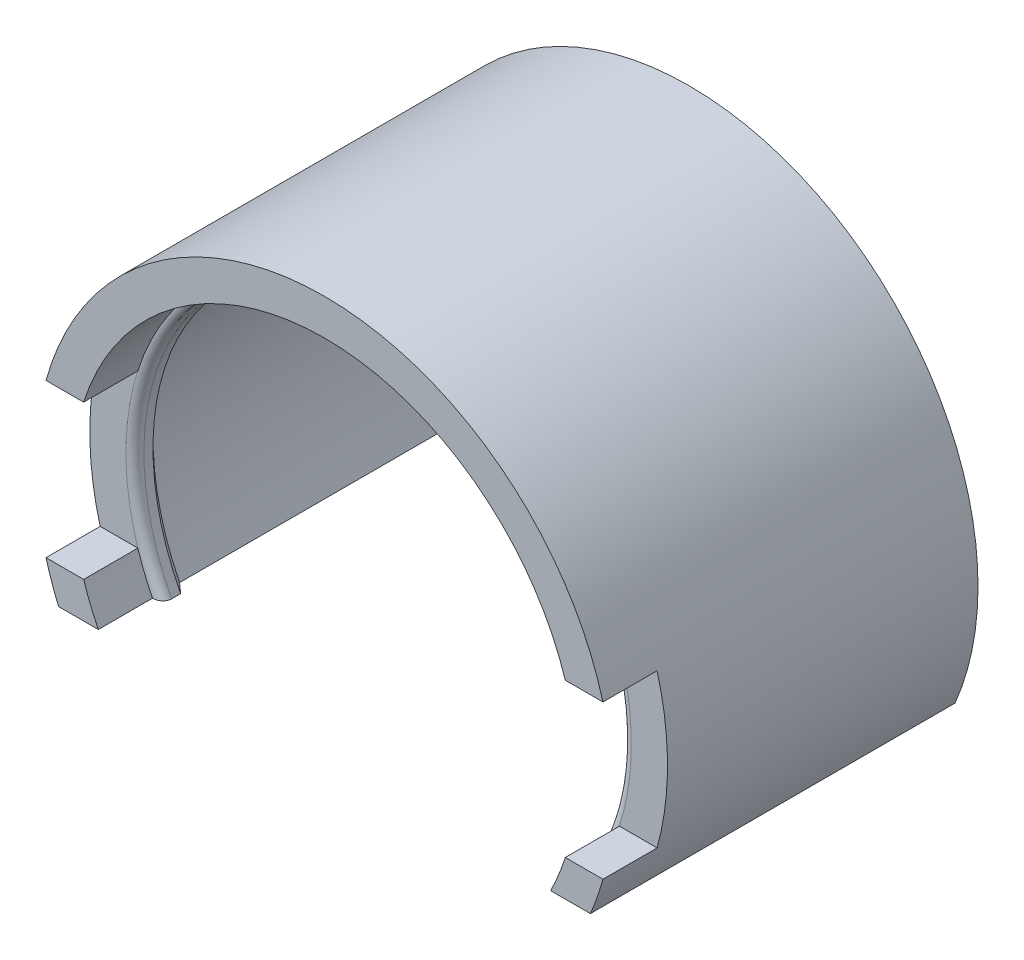
ISO-10303-21;
HEADER;
FILE_DESCRIPTION(('STEP AP214'),'2;1');
FILE_NAME('part.step','',(''),(''),'','','');
FILE_SCHEMA(('AUTOMOTIVE_DESIGN { 1 0 10303 214 1 1 1 1 }'));
ENDSEC;
DATA;
#1=APPLICATION_CONTEXT('core data for automotive mechanical design processes');
#2=APPLICATION_PROTOCOL_DEFINITION('international standard','automotive_design',2000,#1);
#3=PRODUCT_CONTEXT('',#1,'mechanical');
#4=PRODUCT('Part','Part','',(#3));
#5=PRODUCT_RELATED_PRODUCT_CATEGORY('part','',(#4));
#6=PRODUCT_DEFINITION_FORMATION('','',#4);
#7=PRODUCT_DEFINITION_CONTEXT('part definition',#1,'design');
#8=PRODUCT_DEFINITION('design','',#6,#7);
#9=PRODUCT_DEFINITION_SHAPE('','',#8);
#10=(LENGTH_UNIT() NAMED_UNIT(*) SI_UNIT(.MILLI.,.METRE.));
#11=(NAMED_UNIT(*) PLANE_ANGLE_UNIT() SI_UNIT($,.RADIAN.));
#12=(NAMED_UNIT(*) SI_UNIT($,.STERADIAN.) SOLID_ANGLE_UNIT());
#13=UNCERTAINTY_MEASURE_WITH_UNIT(LENGTH_MEASURE(1.E-05),#10,'distance_accuracy_value','');
#14=(GEOMETRIC_REPRESENTATION_CONTEXT(3) GLOBAL_UNCERTAINTY_ASSIGNED_CONTEXT((#13)) GLOBAL_UNIT_ASSIGNED_CONTEXT((#10,
#11,#12)) REPRESENTATION_CONTEXT('',''));
#15=CARTESIAN_POINT('',(0.,0.,0.));
#16=DIRECTION('',(0.,0.,1.));
#17=DIRECTION('',(1.,0.,0.));
#18=AXIS2_PLACEMENT_3D('',#15,#16,#17);
#19=CARTESIAN_POINT('',(0.,0.,16.2));
#20=DIRECTION('',(0.,0.,-1.));
#21=DIRECTION('',(-1.,0.,0.));
#22=AXIS2_PLACEMENT_3D('',#19,#20,#21);
#23=PLANE('',#22);
#24=DIRECTION('',(1.,0.,0.));
#25=VECTOR('',#24,1.);
#26=CARTESIAN_POINT('',(-17.5,-4.25,16.2));
#27=LINE('',#26,#25);
#28=CARTESIAN_POINT('',(-15.4252228509023,-4.25,16.2));
#29=VERTEX_POINT('',#28);
#30=CARTESIAN_POINT('',(-13.3393215719541,-4.25,16.2));
#31=VERTEX_POINT('',#30);
#32=EDGE_CURVE('E383',#29,#31,#27,.T.);
#33=ORIENTED_EDGE('',*,*,#32,.T.);
#34=CARTESIAN_POINT('',(0.,0.,16.2));
#35=DIRECTION('',(0.,0.,-1.));
#36=DIRECTION('',(-1.,0.,0.));
#37=AXIS2_PLACEMENT_3D('',#34,#35,#36);
#38=CIRCLE('',#37,14.);
#39=CARTESIAN_POINT('',(-13.3393215719541,4.25,16.2));
#40=VERTEX_POINT('',#39);
#41=EDGE_CURVE('E189',#31,#40,#38,.T.);
#42=ORIENTED_EDGE('',*,*,#41,.T.);
#43=DIRECTION('',(-1.,0.,0.));
#44=VECTOR('',#43,1.);
#45=CARTESIAN_POINT('',(-17.5,4.25,16.2));
#46=LINE('',#45,#44);
#47=CARTESIAN_POINT('',(-15.4252228509023,4.25,16.2));
#48=VERTEX_POINT('',#47);
#49=EDGE_CURVE('E273',#40,#48,#46,.T.);
#50=ORIENTED_EDGE('',*,*,#49,.T.);
#51=CARTESIAN_POINT('',(0.,0.,16.2));
#52=DIRECTION('',(0.,0.,-1.));
#53=DIRECTION('',(-1.,0.,0.));
#54=AXIS2_PLACEMENT_3D('',#51,#52,#53);
#55=CIRCLE('',#54,16.);
#56=EDGE_CURVE('E352',#29,#48,#55,.T.);
#57=ORIENTED_EDGE('',*,*,#56,.F.);
#58=EDGE_LOOP('',(#33,#42,#50,#57));
#59=FACE_BOUND('',#58,.T.);
#60=ADVANCED_FACE('F49',(#59),#23,.F.);
#61=CARTESIAN_POINT('',(0.,0.,19.2));
#62=DIRECTION('',(0.,0.,-1.));
#63=DIRECTION('',(-1.,0.,0.));
#64=AXIS2_PLACEMENT_3D('',#61,#62,#63);
#65=CYLINDRICAL_SURFACE('',#64,14.);
#66=DIRECTION('',(0.,0.,-1.));
#67=VECTOR('',#66,1.);
#68=CARTESIAN_POINT('',(12.5274698163675,-6.25,19.2));
#69=LINE('',#68,#67);
#70=CARTESIAN_POINT('',(12.5274698163675,-6.25,14.7));
#71=VERTEX_POINT('',#70);
#72=CARTESIAN_POINT('',(12.5274698163675,-6.25,0.));
#73=VERTEX_POINT('',#72);
#74=EDGE_CURVE('E307',#71,#73,#69,.T.);
#75=ORIENTED_EDGE('',*,*,#74,.F.);
#76=CARTESIAN_POINT('',(0.,0.,14.7));
#77=DIRECTION('',(0.,0.,1.));
#78=DIRECTION('',(1.,0.,0.));
#79=AXIS2_PLACEMENT_3D('',#76,#77,#78);
#80=CIRCLE('',#79,14.);
#81=CARTESIAN_POINT('',(-12.5274698163675,-6.25,14.7));
#82=VERTEX_POINT('',#81);
#83=EDGE_CURVE('E185',#71,#82,#80,.T.);
#84=ORIENTED_EDGE('',*,*,#83,.T.);
#85=DIRECTION('',(0.,0.,-1.));
#86=VECTOR('',#85,1.);
#87=CARTESIAN_POINT('',(-12.5274698163675,-6.25,19.2));
#88=LINE('',#87,#86);
#89=CARTESIAN_POINT('',(-12.5274698163675,-6.25,0.));
#90=VERTEX_POINT('',#89);
#91=EDGE_CURVE('E302',#82,#90,#88,.T.);
#92=ORIENTED_EDGE('',*,*,#91,.T.);
#93=CARTESIAN_POINT('',(0.,0.,0.));
#94=DIRECTION('',(0.,0.,1.));
#95=DIRECTION('',(1.,0.,0.));
#96=AXIS2_PLACEMENT_3D('',#93,#94,#95);
#97=CIRCLE('',#96,14.);
#98=EDGE_CURVE('E335',#73,#90,#97,.T.);
#99=ORIENTED_EDGE('',*,*,#98,.F.);
#100=EDGE_LOOP('',(#75,#84,#92,#99));
#101=FACE_BOUND('',#100,.T.);
#102=ADVANCED_FACE('F238',(#101),#65,.F.);
#103=CARTESIAN_POINT('',(0.,0.,16.2));
#104=DIRECTION('',(0.,0.,1.));
#105=DIRECTION('',(1.,0.,0.));
#106=AXIS2_PLACEMENT_3D('',#103,#104,#105);
#107=CIRCLE('',#106,14.);
#108=CARTESIAN_POINT('',(13.3393215719541,4.25,16.2));
#109=VERTEX_POINT('',#108);
#110=EDGE_CURVE('E277',#109,#40,#107,.T.);
#111=ORIENTED_EDGE('',*,*,#110,.F.);
#112=DIRECTION('',(0.,0.,-1.));
#113=VECTOR('',#112,1.);
#114=CARTESIAN_POINT('',(13.3393215719541,4.25,19.2));
#115=LINE('',#114,#113);
#116=CARTESIAN_POINT('',(13.3393215719541,4.25,19.2));
#117=VERTEX_POINT('',#116);
#118=EDGE_CURVE('E377',#117,#109,#115,.T.);
#119=ORIENTED_EDGE('',*,*,#118,.F.);
#120=CARTESIAN_POINT('',(0.,0.,19.2));
#121=DIRECTION('',(0.,0.,1.));
#122=DIRECTION('',(1.,0.,0.));
#123=AXIS2_PLACEMENT_3D('',#120,#121,#122);
#124=CIRCLE('',#123,14.);
#125=CARTESIAN_POINT('',(-13.3393215719541,4.25,19.2));
#126=VERTEX_POINT('',#125);
#127=EDGE_CURVE('E313',#117,#126,#124,.T.);
#128=ORIENTED_EDGE('',*,*,#127,.T.);
#129=DIRECTION('',(0.,0.,-1.));
#130=VECTOR('',#129,1.);
#131=CARTESIAN_POINT('',(-13.3393215719541,4.25,19.2));
#132=LINE('',#131,#130);
#133=EDGE_CURVE('E380',#40,#126,#132,.F.);
#134=ORIENTED_EDGE('',*,*,#133,.F.);
#135=EDGE_LOOP('',(#111,#119,#128,#134));
#136=FACE_BOUND('',#135,.T.);
#137=ADVANCED_FACE('F246',(#136),#65,.F.);
#138=CARTESIAN_POINT('',(-12.5274698163675,-6.25,16.2));
#139=VERTEX_POINT('',#138);
#140=EDGE_CURVE('E394',#31,#139,#107,.T.);
#141=ORIENTED_EDGE('',*,*,#140,.F.);
#142=DIRECTION('',(0.,0.,-1.));
#143=VECTOR('',#142,1.);
#144=CARTESIAN_POINT('',(-13.3393215719541,-4.25,19.2));
#145=LINE('',#144,#143);
#146=CARTESIAN_POINT('',(-13.3393215719541,-4.25,19.2));
#147=VERTEX_POINT('',#146);
#148=EDGE_CURVE('E363',#147,#31,#145,.T.);
#149=ORIENTED_EDGE('',*,*,#148,.F.);
#150=CARTESIAN_POINT('',(-12.5274698163675,-6.25,19.2));
#151=VERTEX_POINT('',#150);
#152=EDGE_CURVE('E315',#147,#151,#124,.T.);
#153=ORIENTED_EDGE('',*,*,#152,.T.);
#154=EDGE_CURVE('E298',#151,#139,#88,.T.);
#155=ORIENTED_EDGE('',*,*,#154,.T.);
#156=EDGE_LOOP('',(#141,#149,#153,#155));
#157=FACE_BOUND('',#156,.T.);
#158=ADVANCED_FACE('F399',(#157),#65,.F.);
#159=CARTESIAN_POINT('',(0.,0.,19.2));
#160=DIRECTION('',(0.,0.,1.));
#161=DIRECTION('',(1.,0.,0.));
#162=AXIS2_PLACEMENT_3D('',#159,#160,#161);
#163=PLANE('',#162);
#164=DIRECTION('',(1.,0.,0.));
#165=VECTOR('',#164,1.);
#166=CARTESIAN_POINT('',(0.,-4.25,19.2));
#167=LINE('',#166,#165);
#168=CARTESIAN_POINT('',(13.3393215719541,-4.25,19.2));
#169=VERTEX_POINT('',#168);
#170=CARTESIAN_POINT('',(15.4252228509023,-4.25,19.2));
#171=VERTEX_POINT('',#170);
#172=EDGE_CURVE('E285',#169,#171,#167,.T.);
#173=ORIENTED_EDGE('',*,*,#172,.F.);
#174=CARTESIAN_POINT('',(12.5274698163675,-6.25,19.2));
#175=VERTEX_POINT('',#174);
#176=EDGE_CURVE('E310',#175,#169,#124,.T.);
#177=ORIENTED_EDGE('',*,*,#176,.F.);
#178=DIRECTION('',(1.,0.,0.));
#179=VECTOR('',#178,1.);
#180=CARTESIAN_POINT('',(0.,-6.25,19.2));
#181=LINE('',#180,#179);
#182=CARTESIAN_POINT('',(14.7287983216554,-6.25,19.2));
#183=VERTEX_POINT('',#182);
#184=EDGE_CURVE('E324',#175,#183,#181,.T.);
#185=ORIENTED_EDGE('',*,*,#184,.T.);
#186=CARTESIAN_POINT('',(0.,0.,19.2));
#187=DIRECTION('',(0.,0.,1.));
#188=DIRECTION('',(1.,0.,0.));
#189=AXIS2_PLACEMENT_3D('',#186,#187,#188);
#190=CIRCLE('',#189,16.);
#191=EDGE_CURVE('E322',#183,#171,#190,.T.);
#192=ORIENTED_EDGE('',*,*,#191,.T.);
#193=EDGE_LOOP('',(#173,#177,#185,#192));
#194=FACE_BOUND('',#193,.T.);
#195=ADVANCED_FACE('F426',(#194),#163,.T.);
#196=CARTESIAN_POINT('',(-15.4252228509023,-4.25,19.2));
#197=VERTEX_POINT('',#196);
#198=EDGE_CURVE('E283',#197,#147,#167,.T.);
#199=ORIENTED_EDGE('',*,*,#198,.F.);
#200=CARTESIAN_POINT('',(-14.7287983216554,-6.25,19.2));
#201=VERTEX_POINT('',#200);
#202=EDGE_CURVE('E329',#197,#201,#190,.T.);
#203=ORIENTED_EDGE('',*,*,#202,.T.);
#204=EDGE_CURVE('E319',#201,#151,#181,.T.);
#205=ORIENTED_EDGE('',*,*,#204,.T.);
#206=ORIENTED_EDGE('',*,*,#152,.F.);
#207=EDGE_LOOP('',(#199,#203,#205,#206));
#208=FACE_BOUND('',#207,.T.);
#209=ADVANCED_FACE('F410',(#208),#163,.T.);
#210=CARTESIAN_POINT('',(0.,0.,19.2));
#211=DIRECTION('',(0.,0.,-1.));
#212=DIRECTION('',(-1.,0.,0.));
#213=AXIS2_PLACEMENT_3D('',#210,#211,#212);
#214=CYLINDRICAL_SURFACE('',#213,16.);
#215=CARTESIAN_POINT('',(15.4252228509023,4.25,16.2));
#216=VERTEX_POINT('',#215);
#217=CARTESIAN_POINT('',(15.4252228509023,-4.25,16.2));
#218=VERTEX_POINT('',#217);
#219=EDGE_CURVE('E267',#216,#218,#55,.T.);
#220=ORIENTED_EDGE('',*,*,#219,.T.);
#221=DIRECTION('',(0.,0.,-1.));
#222=VECTOR('',#221,1.);
#223=CARTESIAN_POINT('',(15.4252228509023,-4.25,19.2));
#224=LINE('',#223,#222);
#225=EDGE_CURVE('E359',#218,#171,#224,.F.);
#226=ORIENTED_EDGE('',*,*,#225,.T.);
#227=ORIENTED_EDGE('',*,*,#191,.F.);
#228=DIRECTION('',(0.,0.,-1.));
#229=VECTOR('',#228,1.);
#230=CARTESIAN_POINT('',(14.7287983216554,-6.25,19.2));
#231=LINE('',#230,#229);
#232=CARTESIAN_POINT('',(14.7287983216554,-6.25,-1.));
#233=VERTEX_POINT('',#232);
#234=EDGE_CURVE('E293',#183,#233,#231,.T.);
#235=ORIENTED_EDGE('',*,*,#234,.T.);
#236=CARTESIAN_POINT('',(0.,0.,-1.));
#237=DIRECTION('',(0.,0.,1.));
#238=DIRECTION('',(1.,0.,0.));
#239=AXIS2_PLACEMENT_3D('',#236,#237,#238);
#240=CIRCLE('',#239,16.);
#241=CARTESIAN_POINT('',(-14.7287983216554,-6.25,-1.));
#242=VERTEX_POINT('',#241);
#243=EDGE_CURVE('E338',#233,#242,#240,.T.);
#244=ORIENTED_EDGE('',*,*,#243,.T.);
#245=DIRECTION('',(0.,0.,-1.));
#246=VECTOR('',#245,1.);
#247=CARTESIAN_POINT('',(-14.7287983216554,-6.25,19.2));
#248=LINE('',#247,#246);
#249=EDGE_CURVE('E295',#201,#242,#248,.T.);
#250=ORIENTED_EDGE('',*,*,#249,.F.);
#251=ORIENTED_EDGE('',*,*,#202,.F.);
#252=DIRECTION('',(0.,0.,-1.));
#253=VECTOR('',#252,1.);
#254=CARTESIAN_POINT('',(-15.4252228509023,-4.25,19.2));
#255=LINE('',#254,#253);
#256=EDGE_CURVE('E356',#197,#29,#255,.T.);
#257=ORIENTED_EDGE('',*,*,#256,.T.);
#258=ORIENTED_EDGE('',*,*,#56,.T.);
#259=DIRECTION('',(0.,0.,-1.));
#260=VECTOR('',#259,1.);
#261=CARTESIAN_POINT('',(-15.4252228509023,4.25,19.2));
#262=LINE('',#261,#260);
#263=CARTESIAN_POINT('',(-15.4252228509023,4.25,19.2));
#264=VERTEX_POINT('',#263);
#265=EDGE_CURVE('E373',#48,#264,#262,.F.);
#266=ORIENTED_EDGE('',*,*,#265,.T.);
#267=CARTESIAN_POINT('',(15.4252228509023,4.25,19.2));
#268=VERTEX_POINT('',#267);
#269=EDGE_CURVE('E327',#268,#264,#190,.T.);
#270=ORIENTED_EDGE('',*,*,#269,.F.);
#271=DIRECTION('',(0.,0.,-1.));
#272=VECTOR('',#271,1.);
#273=CARTESIAN_POINT('',(15.4252228509023,4.25,19.2));
#274=LINE('',#273,#272);
#275=EDGE_CURVE('E370',#268,#216,#274,.T.);
#276=ORIENTED_EDGE('',*,*,#275,.T.);
#277=EDGE_LOOP('',(#220,#226,#227,#235,#244,#250,#251,#257,#258,#266,#270,#276));
#278=FACE_BOUND('',#277,.T.);
#279=ADVANCED_FACE('F205',(#278),#214,.T.);
#280=CARTESIAN_POINT('',(0.,-6.25,19.2));
#281=DIRECTION('',(0.,1.,0.));
#282=DIRECTION('',(0.,0.,1.));
#283=AXIS2_PLACEMENT_3D('',#280,#281,#282);
#284=PLANE('',#283);
#285=DIRECTION('',(0.,0.,1.));
#286=VECTOR('',#285,1.);
#287=CARTESIAN_POINT('',(-11.9660979437743,-6.25,15.2));
#288=LINE('',#287,#286);
#289=CARTESIAN_POINT('',(-11.9660979437743,-6.25,15.2));
#290=VERTEX_POINT('',#289);
#291=CARTESIAN_POINT('',(-11.9660979437743,-6.25,15.7));
#292=VERTEX_POINT('',#291);
#293=EDGE_CURVE('E177',#290,#292,#288,.T.);
#294=ORIENTED_EDGE('',*,*,#293,.T.);
#295=CARTESIAN_POINT('',(-11.9660979437743,-6.25,15.7));
#296=CARTESIAN_POINT('',(-11.9660612244047,-6.25,15.7258731376398));
#297=CARTESIAN_POINT('',(-11.9683610401037,-6.25,15.751719987342));
#298=CARTESIAN_POINT('',(-11.9773384992613,-6.25,15.8025424945894));
#299=CARTESIAN_POINT('',(-11.9839991030807,-6.25,15.8275211461565));
#300=CARTESIAN_POINT('',(-12.0014009985969,-6.25,15.8759841199119));
#301=CARTESIAN_POINT('',(-12.0121394826629,-6.25,15.8994694572919));
#302=CARTESIAN_POINT('',(-12.0372379868125,-6.25,15.9444260138914));
#303=CARTESIAN_POINT('',(-12.0516006169291,-6.25,15.9658957661744));
#304=CARTESIAN_POINT('',(-12.0841577645369,-6.25,16.007322700562));
#305=CARTESIAN_POINT('',(-12.102498198859,-6.25,16.0271648170032));
#306=CARTESIAN_POINT('',(-12.14195516001,-6.25,16.063851790108));
#307=CARTESIAN_POINT('',(-12.1630723763177,-6.25,16.0806958999094));
#308=CARTESIAN_POINT('',(-12.2098948016313,-6.25,16.1128240860608));
#309=CARTESIAN_POINT('',(-12.2358491922633,-6.25,16.127744828897));
#310=CARTESIAN_POINT('',(-12.2897260601089,-6.25,16.1534941398177));
#311=CARTESIAN_POINT('',(-12.317650113551,-6.25,16.1643193853597));
#312=CARTESIAN_POINT('',(-12.3755534553564,-6.25,16.1820056719129));
#313=CARTESIAN_POINT('',(-12.4055679739487,-6.25,16.1887509864137));
#314=CARTESIAN_POINT('',(-12.46621480713,-6.25,16.197747197865));
#315=CARTESIAN_POINT('',(-12.4968460487812,-6.25,16.2000053163835));
#316=CARTESIAN_POINT('',(-12.5274698163675,-6.25,16.2));
#317=B_SPLINE_CURVE_WITH_KNOTS('',3,(#295,#296,#297,#298,#299,#300,#301,#302,#303,#304,#305,
#306,#307,#308,#309,#310,#311,#312,#313,#314,#315,#316),.UNSPECIFIED.,.F.,.F.,(4,2,2,2,2,2,2,2,
2,2,4),(0.,0.0774762161737595,0.154651488947578,0.23177372240639,0.308951656973754,
0.389681047423808,0.470430521078819,0.559875751106978,0.649393390299015,0.741343770006489,
0.833146047097731),.UNSPECIFIED.);
#318=EDGE_CURVE('E217',#292,#139,#317,.T.);
#319=ORIENTED_EDGE('',*,*,#318,.T.);
#320=ORIENTED_EDGE('',*,*,#154,.F.);
#321=ORIENTED_EDGE('',*,*,#204,.F.);
#322=ORIENTED_EDGE('',*,*,#249,.T.);
#323=DIRECTION('',(1.,0.,0.));
#324=VECTOR('',#323,1.);
#325=CARTESIAN_POINT('',(0.,-6.25,-1.));
#326=LINE('',#325,#324);
#327=EDGE_CURVE('E342',#242,#233,#326,.T.);
#328=ORIENTED_EDGE('',*,*,#327,.T.);
#329=ORIENTED_EDGE('',*,*,#234,.F.);
#330=ORIENTED_EDGE('',*,*,#184,.F.);
#331=CARTESIAN_POINT('',(12.5274698163675,-6.25,16.2));
#332=VERTEX_POINT('',#331);
#333=EDGE_CURVE('E305',#175,#332,#69,.T.);
#334=ORIENTED_EDGE('',*,*,#333,.T.);
#335=CARTESIAN_POINT('',(12.5274698163675,-6.25,16.2));
#336=CARTESIAN_POINT('',(12.4929481886996,-6.25,16.2000083280259));
#337=CARTESIAN_POINT('',(12.4584147901693,-6.25,16.1971369490834));
#338=CARTESIAN_POINT('',(12.3902008401909,-6.25,16.1857011589622));
#339=CARTESIAN_POINT('',(12.356523113505,-6.25,16.1771199335543));
#340=CARTESIAN_POINT('',(12.2910640462178,-6.25,16.1543147656869));
#341=CARTESIAN_POINT('',(12.2592856021033,-6.25,16.1400824455913));
#342=CARTESIAN_POINT('',(12.1988016223828,-6.25,16.1061696947014));
#343=CARTESIAN_POINT('',(12.1700926300874,-6.25,16.0864954838847));
#344=CARTESIAN_POINT('',(12.1185156317061,-6.25,16.0433773498287));
#345=CARTESIAN_POINT('',(12.0954006268745,-6.25,16.0202301601939));
#346=CARTESIAN_POINT('',(12.0540015331993,-6.25,15.9699284949292));
#347=CARTESIAN_POINT('',(12.0357154503767,-6.25,15.9427756805605));
#348=CARTESIAN_POINT('',(12.0068148349706,-6.25,15.8886538354962));
#349=CARTESIAN_POINT('',(11.9955573482469,-6.25,15.8620272742049));
#350=CARTESIAN_POINT('',(11.9782736091589,-6.25,15.8071568824757));
#351=CARTESIAN_POINT('',(11.972234106938,-6.25,15.7789173435927));
#352=CARTESIAN_POINT('',(11.9680139710578,-6.25,15.7420366491277));
#353=CARTESIAN_POINT('',(11.9672954330988,-6.25,15.7336392243611));
#354=CARTESIAN_POINT('',(11.9663381457884,-6.25,15.7168292657543));
#355=CARTESIAN_POINT('',(11.9660987026863,-6.25,15.7084167714421));
#356=CARTESIAN_POINT('',(11.9660979437743,-6.25,15.7));
#357=B_SPLINE_CURVE_WITH_KNOTS('',3,(#335,#336,#337,#338,#339,#340,#341,#342,#343,#344,#345,
#346,#347,#348,#349,#350,#351,#352,#353,#354,#355,#356),.UNSPECIFIED.,.F.,.F.,(4,2,2,2,2,2,2,2,
2,2,4),(0.,0.10346737035375,0.207240785592337,0.311168620720799,0.414978155704659,
0.512563797840991,0.61010908126744,0.69636434124038,0.782399926863861,0.807674932952631,
0.832913313145122),.UNSPECIFIED.);
#358=CARTESIAN_POINT('',(11.9660979437743,-6.25,15.7));
#359=VERTEX_POINT('',#358);
#360=EDGE_CURVE('E172',#332,#359,#357,.T.);
#361=ORIENTED_EDGE('',*,*,#360,.T.);
#362=DIRECTION('',(0.,0.,1.));
#363=VECTOR('',#362,1.);
#364=CARTESIAN_POINT('',(11.9660979437743,-6.25,15.2));
#365=LINE('',#364,#363);
#366=CARTESIAN_POINT('',(11.9660979437743,-6.25,15.2));
#367=VERTEX_POINT('',#366);
#368=EDGE_CURVE('E166',#367,#359,#365,.T.);
#369=ORIENTED_EDGE('',*,*,#368,.F.);
#370=CARTESIAN_POINT('',(11.9660979437743,-6.25,15.2));
#371=CARTESIAN_POINT('',(12.0598559988653,-6.25,15.116886805394));
#372=CARTESIAN_POINT('',(12.1535160169683,-6.25,15.0336635403731));
#373=CARTESIAN_POINT('',(12.3406399744895,-6.25,14.8669968736953));
#374=CARTESIAN_POINT('',(12.4341039139176,-6.25,14.7835534720496));
#375=CARTESIAN_POINT('',(12.5274698163675,-6.25,14.7));
#376=B_SPLINE_CURVE_WITH_KNOTS('',3,(#370,#371,#372,#373,#374,#375),.UNSPECIFIED.,.F.,.F.,(4,2,
4),(0.,0.375878700495647,0.751757382073281),.UNSPECIFIED.);
#377=EDGE_CURVE('E11',#367,#71,#376,.T.);
#378=ORIENTED_EDGE('',*,*,#377,.T.);
#379=ORIENTED_EDGE('',*,*,#74,.T.);
#380=DIRECTION('',(1.,0.,0.));
#381=VECTOR('',#380,1.);
#382=CARTESIAN_POINT('',(0.,-6.25,0.));
#383=LINE('',#382,#381);
#384=EDGE_CURVE('E346',#90,#73,#383,.T.);
#385=ORIENTED_EDGE('',*,*,#384,.F.);
#386=ORIENTED_EDGE('',*,*,#91,.F.);
#387=CARTESIAN_POINT('',(-12.5274698163675,-6.25,14.7));
#388=CARTESIAN_POINT('',(-12.4341039139176,-6.25,14.7835534720496));
#389=CARTESIAN_POINT('',(-12.3406399744895,-6.25,14.8669968736953));
#390=CARTESIAN_POINT('',(-12.1535160169683,-6.25,15.0336635403731));
#391=CARTESIAN_POINT('',(-12.0598559988653,-6.25,15.116886805394));
#392=CARTESIAN_POINT('',(-11.9660979437743,-6.25,15.2));
#393=B_SPLINE_CURVE_WITH_KNOTS('',3,(#387,#388,#389,#390,#391,#392),.UNSPECIFIED.,.F.,.F.,(4,2,
4),(0.,0.375878681577635,0.751757382073282),.UNSPECIFIED.);
#394=EDGE_CURVE('E65',#82,#290,#393,.T.);
#395=ORIENTED_EDGE('',*,*,#394,.T.);
#396=EDGE_LOOP('',(#294,#319,#320,#321,#322,#328,#329,#330,#334,#361,#369,#378,#379,#385,#386,#395));
#397=FACE_BOUND('',#396,.T.);
#398=ADVANCED_FACE('F169',(#397),#284,.F.);
#399=CARTESIAN_POINT('',(13.3393215719541,-4.25,16.2));
#400=VERTEX_POINT('',#399);
#401=EDGE_CURVE('E183',#332,#400,#107,.T.);
#402=ORIENTED_EDGE('',*,*,#401,.F.);
#403=ORIENTED_EDGE('',*,*,#333,.F.);
#404=ORIENTED_EDGE('',*,*,#176,.T.);
#405=DIRECTION('',(0.,0.,-1.));
#406=VECTOR('',#405,1.);
#407=CARTESIAN_POINT('',(13.3393215719541,-4.25,19.2));
#408=LINE('',#407,#406);
#409=EDGE_CURVE('E367',#400,#169,#408,.F.);
#410=ORIENTED_EDGE('',*,*,#409,.F.);
#411=EDGE_LOOP('',(#402,#403,#404,#410));
#412=FACE_BOUND('',#411,.T.);
#413=ADVANCED_FACE('F204',(#412),#65,.F.);
#414=DIRECTION('',(-1.,0.,0.));
#415=VECTOR('',#414,1.);
#416=CARTESIAN_POINT('',(0.,4.25,19.2));
#417=LINE('',#416,#415);
#418=EDGE_CURVE('E288',#268,#117,#417,.T.);
#419=ORIENTED_EDGE('',*,*,#418,.F.);
#420=ORIENTED_EDGE('',*,*,#269,.T.);
#421=EDGE_CURVE('E290',#126,#264,#417,.T.);
#422=ORIENTED_EDGE('',*,*,#421,.F.);
#423=ORIENTED_EDGE('',*,*,#127,.F.);
#424=EDGE_LOOP('',(#419,#420,#422,#423));
#425=FACE_BOUND('',#424,.T.);
#426=ADVANCED_FACE('F418',(#425),#163,.T.);
#427=CARTESIAN_POINT('',(0.,0.,0.));
#428=DIRECTION('',(0.,0.,1.));
#429=DIRECTION('',(1.,0.,0.));
#430=AXIS2_PLACEMENT_3D('',#427,#428,#429);
#431=PLANE('',#430);
#432=ORIENTED_EDGE('',*,*,#384,.T.);
#433=ORIENTED_EDGE('',*,*,#98,.T.);
#434=EDGE_LOOP('',(#432,#433));
#435=FACE_BOUND('',#434,.T.);
#436=ADVANCED_FACE('F415',(#435),#431,.T.);
#437=CARTESIAN_POINT('',(0.,0.,-1.));
#438=DIRECTION('',(0.,0.,1.));
#439=DIRECTION('',(1.,0.,0.));
#440=AXIS2_PLACEMENT_3D('',#437,#438,#439);
#441=PLANE('',#440);
#442=ORIENTED_EDGE('',*,*,#327,.F.);
#443=ORIENTED_EDGE('',*,*,#243,.F.);
#444=EDGE_LOOP('',(#442,#443));
#445=FACE_BOUND('',#444,.T.);
#446=ADVANCED_FACE('F417',(#445),#441,.F.);
#447=CARTESIAN_POINT('',(-17.5,4.25,16.2));
#448=DIRECTION('',(0.,1.,0.));
#449=DIRECTION('',(0.,0.,1.));
#450=AXIS2_PLACEMENT_3D('',#447,#448,#449);
#451=PLANE('',#450);
#452=ORIENTED_EDGE('',*,*,#49,.F.);
#453=ORIENTED_EDGE('',*,*,#133,.T.);
#454=ORIENTED_EDGE('',*,*,#421,.T.);
#455=ORIENTED_EDGE('',*,*,#265,.F.);
#456=EDGE_LOOP('',(#452,#453,#454,#455));
#457=FACE_BOUND('',#456,.T.);
#458=ADVANCED_FACE('F258',(#457),#451,.F.);
#459=CARTESIAN_POINT('',(-17.5,-4.25,16.2));
#460=DIRECTION('',(0.,-1.,0.));
#461=DIRECTION('',(0.,0.,-1.));
#462=AXIS2_PLACEMENT_3D('',#459,#460,#461);
#463=PLANE('',#462);
#464=ORIENTED_EDGE('',*,*,#198,.T.);
#465=ORIENTED_EDGE('',*,*,#148,.T.);
#466=ORIENTED_EDGE('',*,*,#32,.F.);
#467=ORIENTED_EDGE('',*,*,#256,.F.);
#468=EDGE_LOOP('',(#464,#465,#466,#467));
#469=FACE_BOUND('',#468,.T.);
#470=ADVANCED_FACE('F251',(#469),#463,.F.);
#471=EDGE_CURVE('E262',#216,#109,#46,.T.);
#472=ORIENTED_EDGE('',*,*,#471,.T.);
#473=CARTESIAN_POINT('',(0.,0.,16.2));
#474=DIRECTION('',(0.,0.,-1.));
#475=DIRECTION('',(-1.,0.,0.));
#476=AXIS2_PLACEMENT_3D('',#473,#474,#475);
#477=CIRCLE('',#476,14.);
#478=EDGE_CURVE('E193',#109,#400,#477,.T.);
#479=ORIENTED_EDGE('',*,*,#478,.T.);
#480=EDGE_CURVE('E272',#400,#218,#27,.T.);
#481=ORIENTED_EDGE('',*,*,#480,.T.);
#482=ORIENTED_EDGE('',*,*,#219,.F.);
#483=EDGE_LOOP('',(#472,#479,#481,#482));
#484=FACE_BOUND('',#483,.T.);
#485=ADVANCED_FACE('F241',(#484),#23,.F.);
#486=ORIENTED_EDGE('',*,*,#480,.F.);
#487=ORIENTED_EDGE('',*,*,#409,.T.);
#488=ORIENTED_EDGE('',*,*,#172,.T.);
#489=ORIENTED_EDGE('',*,*,#225,.F.);
#490=EDGE_LOOP('',(#486,#487,#488,#489));
#491=FACE_BOUND('',#490,.T.);
#492=ADVANCED_FACE('F250',(#491),#463,.F.);
#493=ORIENTED_EDGE('',*,*,#418,.T.);
#494=ORIENTED_EDGE('',*,*,#118,.T.);
#495=ORIENTED_EDGE('',*,*,#471,.F.);
#496=ORIENTED_EDGE('',*,*,#275,.F.);
#497=EDGE_LOOP('',(#493,#494,#495,#496));
#498=FACE_BOUND('',#497,.T.);
#499=ADVANCED_FACE('F234',(#498),#451,.F.);
#500=CARTESIAN_POINT('',(0.,0.,15.2));
#501=DIRECTION('',(0.,0.,1.));
#502=DIRECTION('',(1.,0.,0.));
#503=AXIS2_PLACEMENT_3D('',#500,#501,#502);
#504=CYLINDRICAL_SURFACE('',#503,13.5);
#505=ORIENTED_EDGE('',*,*,#368,.T.);
#506=CARTESIAN_POINT('',(0.,0.,15.7));
#507=DIRECTION('',(0.,0.,-1.));
#508=DIRECTION('',(-1.,0.,0.));
#509=AXIS2_PLACEMENT_3D('',#506,#507,#508);
#510=CIRCLE('',#509,13.5);
#511=EDGE_CURVE('E281',#359,#292,#510,.F.);
#512=ORIENTED_EDGE('',*,*,#511,.T.);
#513=ORIENTED_EDGE('',*,*,#293,.F.);
#514=CARTESIAN_POINT('',(0.,0.,15.2));
#515=DIRECTION('',(0.,0.,1.));
#516=DIRECTION('',(1.,0.,0.));
#517=AXIS2_PLACEMENT_3D('',#514,#515,#516);
#518=CIRCLE('',#517,13.5);
#519=EDGE_CURVE('E178',#367,#290,#518,.T.);
#520=ORIENTED_EDGE('',*,*,#519,.F.);
#521=EDGE_LOOP('',(#505,#512,#513,#520));
#522=FACE_BOUND('',#521,.T.);
#523=ADVANCED_FACE('F181',(#522),#504,.F.);
#524=CARTESIAN_POINT('',(0.,0.,15.7));
#525=DIRECTION('',(0.,0.,-1.));
#526=DIRECTION('',(-1.,0.,0.));
#527=AXIS2_PLACEMENT_3D('',#524,#525,#526);
#528=TOROIDAL_SURFACE('',#527,14.,0.5);
#529=ORIENTED_EDGE('',*,*,#41,.F.);
#530=ORIENTED_EDGE('',*,*,#140,.T.);
#531=ORIENTED_EDGE('',*,*,#318,.F.);
#532=ORIENTED_EDGE('',*,*,#511,.F.);
#533=ORIENTED_EDGE('',*,*,#360,.F.);
#534=ORIENTED_EDGE('',*,*,#401,.T.);
#535=ORIENTED_EDGE('',*,*,#478,.F.);
#536=ORIENTED_EDGE('',*,*,#110,.T.);
#537=EDGE_LOOP('',(#529,#530,#531,#532,#533,#534,#535,#536));
#538=FACE_BOUND('',#537,.T.);
#539=ADVANCED_FACE('F223',(#538),#528,.T.);
#540=CARTESIAN_POINT('',(0.,0.,14.7));
#541=DIRECTION('',(0.,0.,-1.));
#542=DIRECTION('',(-1.,0.,0.));
#543=AXIS2_PLACEMENT_3D('',#540,#541,#542);
#544=CONICAL_SURFACE('',#543,14.,0.785398163397443);
#545=ORIENTED_EDGE('',*,*,#377,.F.);
#546=ORIENTED_EDGE('',*,*,#519,.T.);
#547=ORIENTED_EDGE('',*,*,#394,.F.);
#548=ORIENTED_EDGE('',*,*,#83,.F.);
#549=EDGE_LOOP('',(#545,#546,#547,#548));
#550=FACE_BOUND('',#549,.T.);
#551=ADVANCED_FACE('F52',(#550),#544,.F.);
#552=CLOSED_SHELL('',(#60,#102,#137,#158,#195,#209,#279,#398,#413,#426,#436,#446,#458,#470,#485,
#492,#499,#523,#539,#551));
#553=MANIFOLD_SOLID_BREP('B2',#552);
#554=ADVANCED_BREP_SHAPE_REPRESENTATION('',(#18,#553),#14);
#555=SHAPE_DEFINITION_REPRESENTATION(#9,#554);
ENDSEC;
END-ISO-10303-21;
